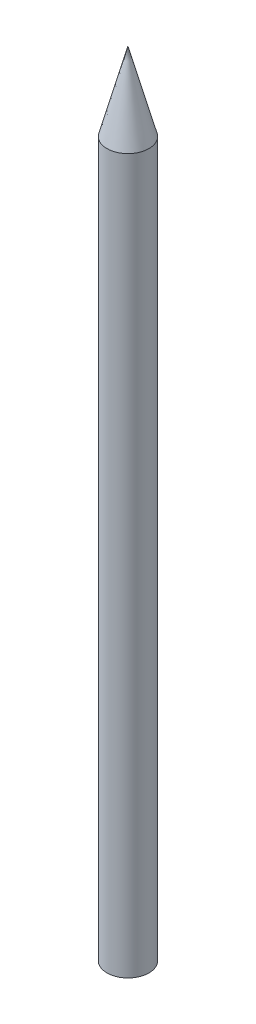
ISO-10303-21;
HEADER;
FILE_DESCRIPTION(('STEP AP214'),'2;1');
FILE_NAME('part.step','',(''),(''),'','','');
FILE_SCHEMA(('AUTOMOTIVE_DESIGN { 1 0 10303 214 1 1 1 1 }'));
ENDSEC;
DATA;
#1=APPLICATION_CONTEXT('core data for automotive mechanical design processes');
#2=APPLICATION_PROTOCOL_DEFINITION('international standard','automotive_design',2000,#1);
#3=PRODUCT_CONTEXT('',#1,'mechanical');
#4=PRODUCT('Part','Part','',(#3));
#5=PRODUCT_RELATED_PRODUCT_CATEGORY('part','',(#4));
#6=PRODUCT_DEFINITION_FORMATION('','',#4);
#7=PRODUCT_DEFINITION_CONTEXT('part definition',#1,'design');
#8=PRODUCT_DEFINITION('design','',#6,#7);
#9=PRODUCT_DEFINITION_SHAPE('','',#8);
#10=(LENGTH_UNIT() NAMED_UNIT(*) SI_UNIT(.MILLI.,.METRE.));
#11=(NAMED_UNIT(*) PLANE_ANGLE_UNIT() SI_UNIT($,.RADIAN.));
#12=(NAMED_UNIT(*) SI_UNIT($,.STERADIAN.) SOLID_ANGLE_UNIT());
#13=UNCERTAINTY_MEASURE_WITH_UNIT(LENGTH_MEASURE(1.E-05),#10,'distance_accuracy_value','');
#14=(GEOMETRIC_REPRESENTATION_CONTEXT(3) GLOBAL_UNCERTAINTY_ASSIGNED_CONTEXT((#13)) GLOBAL_UNIT_ASSIGNED_CONTEXT((#10,
#11,#12)) REPRESENTATION_CONTEXT('',''));
#15=CARTESIAN_POINT('',(0.,0.,0.));
#16=DIRECTION('',(0.,0.,1.));
#17=DIRECTION('',(1.,0.,0.));
#18=AXIS2_PLACEMENT_3D('',#15,#16,#17);
#19=CARTESIAN_POINT('',(0.,-0.988993464005782,0.));
#20=DIRECTION('',(0.,-1.,0.));
#21=DIRECTION('',(0.,0.,-1.));
#22=AXIS2_PLACEMENT_3D('',#19,#20,#21);
#23=CONICAL_SURFACE('',#22,0.265000000000001,0.261799387799143);
#24=CARTESIAN_POINT('',(0.,0.,0.));
#25=VERTEX_POINT('',#24);
#26=VERTEX_LOOP('',#25);
#27=FACE_BOUND('',#26,.T.);
#28=CARTESIAN_POINT('',(0.,-0.988993464005782,0.));
#29=DIRECTION('',(0.,1.,0.));
#30=DIRECTION('',(0.,0.,1.));
#31=AXIS2_PLACEMENT_3D('',#28,#29,#30);
#32=CIRCLE('',#31,0.265000000000001);
#33=CARTESIAN_POINT('',(0.,-0.988993464005782,0.265000000000001));
#34=VERTEX_POINT('',#33);
#35=EDGE_CURVE('E11',#34,#34,#32,.T.);
#36=ORIENTED_EDGE('',*,*,#35,.T.);
#37=EDGE_LOOP('',(#36));
#38=FACE_BOUND('',#37,.T.);
#39=ADVANCED_FACE('F35',(#27,#38),#23,.T.);
#40=CARTESIAN_POINT('',(0.,0.,0.));
#41=DIRECTION('',(0.,1.,0.));
#42=DIRECTION('',(0.,0.,1.));
#43=AXIS2_PLACEMENT_3D('',#40,#41,#42);
#44=CYLINDRICAL_SURFACE('',#43,0.265000000000001);
#45=ORIENTED_EDGE('',*,*,#35,.F.);
#46=EDGE_LOOP('',(#45));
#47=FACE_BOUND('',#46,.T.);
#48=CARTESIAN_POINT('',(0.,-10.,0.));
#49=DIRECTION('',(0.,1.,0.));
#50=DIRECTION('',(0.,0.,1.));
#51=AXIS2_PLACEMENT_3D('',#48,#49,#50);
#52=CIRCLE('',#51,0.265);
#53=CARTESIAN_POINT('',(0.,-10.,0.264999999999999));
#54=VERTEX_POINT('',#53);
#55=EDGE_CURVE('E41',#54,#54,#52,.T.);
#56=ORIENTED_EDGE('',*,*,#55,.T.);
#57=EDGE_LOOP('',(#56));
#58=FACE_BOUND('',#57,.T.);
#59=ADVANCED_FACE('F46',(#47,#58),#44,.T.);
#60=CARTESIAN_POINT('',(0.,-10.,0.));
#61=DIRECTION('',(0.,1.,0.));
#62=DIRECTION('',(0.,0.,1.));
#63=AXIS2_PLACEMENT_3D('',#60,#61,#62);
#64=PLANE('',#63);
#65=ORIENTED_EDGE('',*,*,#55,.F.);
#66=EDGE_LOOP('',(#65));
#67=FACE_BOUND('',#66,.T.);
#68=ADVANCED_FACE('F51',(#67),#64,.F.);
#69=CLOSED_SHELL('',(#39,#59,#68));
#70=MANIFOLD_SOLID_BREP('B2',#69);
#71=ADVANCED_BREP_SHAPE_REPRESENTATION('',(#18,#70),#14);
#72=SHAPE_DEFINITION_REPRESENTATION(#9,#71);
ENDSEC;
END-ISO-10303-21;
